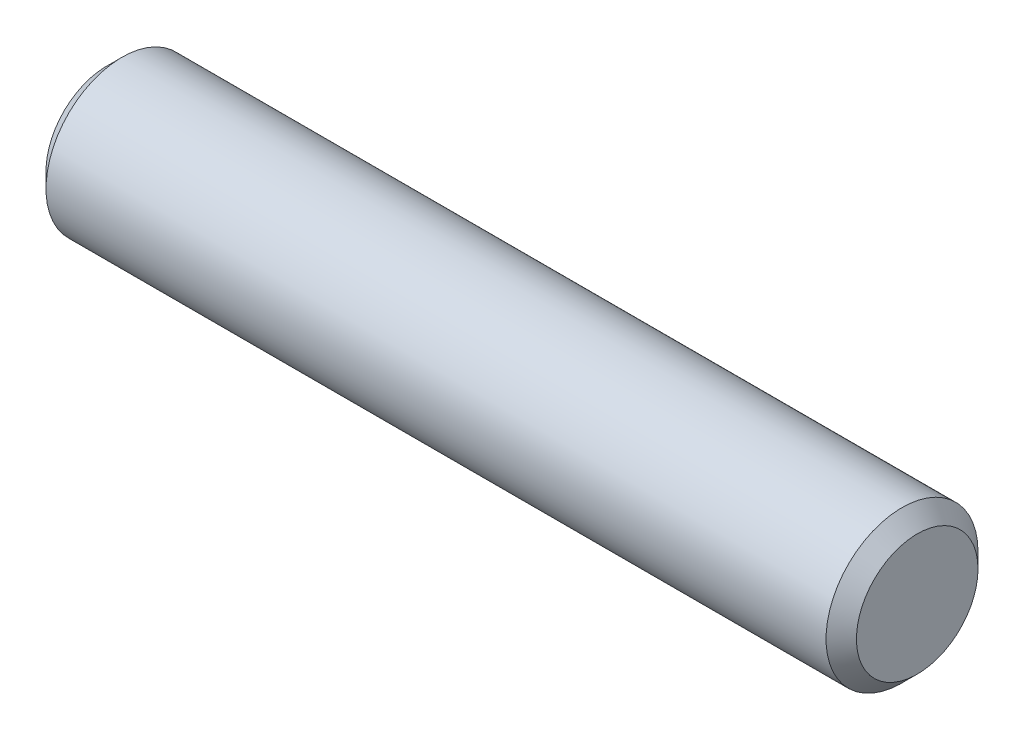
ISO-10303-21;
HEADER;
FILE_DESCRIPTION(('STEP AP214'),'2;1');
FILE_NAME('part.step','',(''),(''),'','','');
FILE_SCHEMA(('AUTOMOTIVE_DESIGN { 1 0 10303 214 1 1 1 1 }'));
ENDSEC;
DATA;
#1=APPLICATION_CONTEXT('core data for automotive mechanical design processes');
#2=APPLICATION_PROTOCOL_DEFINITION('international standard','automotive_design',2000,#1);
#3=PRODUCT_CONTEXT('',#1,'mechanical');
#4=PRODUCT('Part','Part','',(#3));
#5=PRODUCT_RELATED_PRODUCT_CATEGORY('part','',(#4));
#6=PRODUCT_DEFINITION_FORMATION('','',#4);
#7=PRODUCT_DEFINITION_CONTEXT('part definition',#1,'design');
#8=PRODUCT_DEFINITION('design','',#6,#7);
#9=PRODUCT_DEFINITION_SHAPE('','',#8);
#10=(LENGTH_UNIT() NAMED_UNIT(*) SI_UNIT(.MILLI.,.METRE.));
#11=(NAMED_UNIT(*) PLANE_ANGLE_UNIT() SI_UNIT($,.RADIAN.));
#12=(NAMED_UNIT(*) SI_UNIT($,.STERADIAN.) SOLID_ANGLE_UNIT());
#13=UNCERTAINTY_MEASURE_WITH_UNIT(LENGTH_MEASURE(1.E-05),#10,'distance_accuracy_value','');
#14=(GEOMETRIC_REPRESENTATION_CONTEXT(3) GLOBAL_UNCERTAINTY_ASSIGNED_CONTEXT((#13)) GLOBAL_UNIT_ASSIGNED_CONTEXT((#10,
#11,#12)) REPRESENTATION_CONTEXT('',''));
#15=CARTESIAN_POINT('',(0.,0.,0.));
#16=DIRECTION('',(0.,0.,1.));
#17=DIRECTION('',(1.,0.,0.));
#18=AXIS2_PLACEMENT_3D('',#15,#16,#17);
#19=CARTESIAN_POINT('',(-25.4,0.,0.));
#20=DIRECTION('',(1.,0.,0.));
#21=DIRECTION('',(0.,0.,-1.));
#22=AXIS2_PLACEMENT_3D('',#19,#20,#21);
#23=CYLINDRICAL_SURFACE('',#22,4.7625);
#24=CARTESIAN_POINT('',(24.4475,0.,0.));
#25=DIRECTION('',(1.,0.,0.));
#26=DIRECTION('',(0.,0.,-1.));
#27=AXIS2_PLACEMENT_3D('',#24,#25,#26);
#28=CIRCLE('',#27,4.7625);
#29=CARTESIAN_POINT('',(24.4475,0.,-4.7625));
#30=VERTEX_POINT('',#29);
#31=EDGE_CURVE('E37',#30,#30,#28,.F.);
#32=ORIENTED_EDGE('',*,*,#31,.T.);
#33=EDGE_LOOP('',(#32));
#34=FACE_BOUND('',#33,.T.);
#35=CARTESIAN_POINT('',(-24.4475,0.,0.));
#36=DIRECTION('',(1.,0.,0.));
#37=DIRECTION('',(0.,0.,-1.));
#38=AXIS2_PLACEMENT_3D('',#35,#36,#37);
#39=CIRCLE('',#38,4.7625);
#40=CARTESIAN_POINT('',(-24.4475,0.,-4.7625));
#41=VERTEX_POINT('',#40);
#42=EDGE_CURVE('E41',#41,#41,#39,.T.);
#43=ORIENTED_EDGE('',*,*,#42,.T.);
#44=EDGE_LOOP('',(#43));
#45=FACE_BOUND('',#44,.T.);
#46=ADVANCED_FACE('F30',(#34,#45),#23,.T.);
#47=CARTESIAN_POINT('',(-25.4,0.,0.));
#48=DIRECTION('',(1.,0.,0.));
#49=DIRECTION('',(0.,0.,-1.));
#50=AXIS2_PLACEMENT_3D('',#47,#48,#49);
#51=PLANE('',#50);
#52=CARTESIAN_POINT('',(-25.4,0.,0.));
#53=DIRECTION('',(1.,0.,0.));
#54=DIRECTION('',(0.,0.,-1.));
#55=AXIS2_PLACEMENT_3D('',#52,#53,#54);
#56=CIRCLE('',#55,3.81);
#57=CARTESIAN_POINT('',(-25.4,0.,-3.81));
#58=VERTEX_POINT('',#57);
#59=EDGE_CURVE('E10',#58,#58,#56,.F.);
#60=ORIENTED_EDGE('',*,*,#59,.T.);
#61=EDGE_LOOP('',(#60));
#62=FACE_BOUND('',#61,.T.);
#63=ADVANCED_FACE('F61',(#62),#51,.F.);
#64=CARTESIAN_POINT('',(25.4,0.,0.));
#65=DIRECTION('',(1.,0.,0.));
#66=DIRECTION('',(0.,0.,-1.));
#67=AXIS2_PLACEMENT_3D('',#64,#65,#66);
#68=PLANE('',#67);
#69=CARTESIAN_POINT('',(25.4,0.,0.));
#70=DIRECTION('',(1.,0.,0.));
#71=DIRECTION('',(0.,0.,-1.));
#72=AXIS2_PLACEMENT_3D('',#69,#70,#71);
#73=CIRCLE('',#72,3.81);
#74=CARTESIAN_POINT('',(25.4,0.,-3.81));
#75=VERTEX_POINT('',#74);
#76=EDGE_CURVE('E45',#75,#75,#73,.T.);
#77=ORIENTED_EDGE('',*,*,#76,.T.);
#78=EDGE_LOOP('',(#77));
#79=FACE_BOUND('',#78,.T.);
#80=ADVANCED_FACE('F51',(#79),#68,.T.);
#81=CARTESIAN_POINT('',(25.4,0.,0.));
#82=DIRECTION('',(-1.,0.,0.));
#83=DIRECTION('',(0.,0.,1.));
#84=AXIS2_PLACEMENT_3D('',#81,#82,#83);
#85=CONICAL_SURFACE('',#84,3.81,0.785398163397451);
#86=ORIENTED_EDGE('',*,*,#31,.F.);
#87=EDGE_LOOP('',(#86));
#88=FACE_BOUND('',#87,.T.);
#89=ORIENTED_EDGE('',*,*,#76,.F.);
#90=EDGE_LOOP('',(#89));
#91=FACE_BOUND('',#90,.T.);
#92=ADVANCED_FACE('F53',(#88,#91),#85,.T.);
#93=CARTESIAN_POINT('',(-24.4475,0.,0.));
#94=DIRECTION('',(1.,0.,0.));
#95=DIRECTION('',(0.,0.,-1.));
#96=AXIS2_PLACEMENT_3D('',#93,#94,#95);
#97=CONICAL_SURFACE('',#96,4.7625,0.785398163397451);
#98=ORIENTED_EDGE('',*,*,#59,.F.);
#99=EDGE_LOOP('',(#98));
#100=FACE_BOUND('',#99,.T.);
#101=ORIENTED_EDGE('',*,*,#42,.F.);
#102=EDGE_LOOP('',(#101));
#103=FACE_BOUND('',#102,.T.);
#104=ADVANCED_FACE('F32',(#100,#103),#97,.T.);
#105=CLOSED_SHELL('',(#46,#63,#80,#92,#104));
#106=MANIFOLD_SOLID_BREP('B2',#105);
#107=ADVANCED_BREP_SHAPE_REPRESENTATION('',(#18,#106),#14);
#108=SHAPE_DEFINITION_REPRESENTATION(#9,#107);
ENDSEC;
END-ISO-10303-21;
